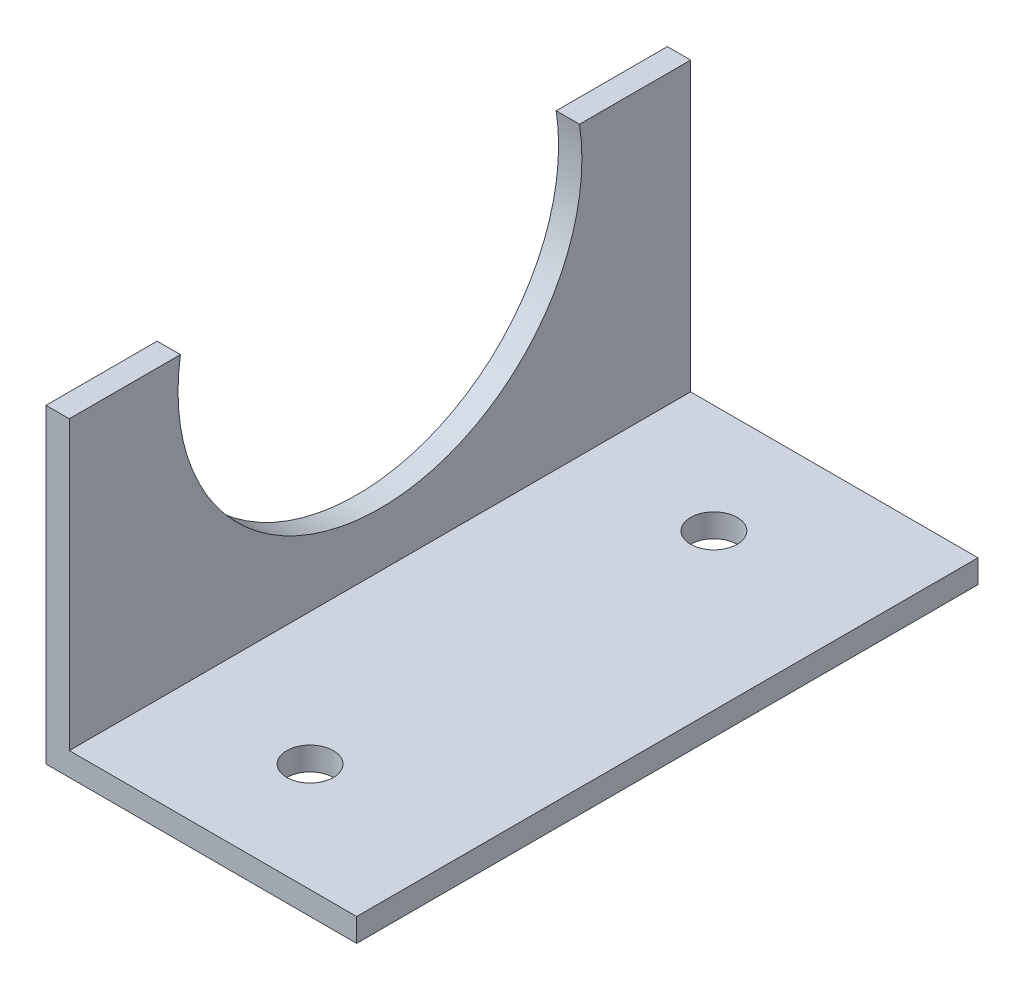
ISO-10303-21;
HEADER;
FILE_DESCRIPTION(('STEP AP214'),'2;1');
FILE_NAME('part.step','',(''),(''),'','','');
FILE_SCHEMA(('AUTOMOTIVE_DESIGN { 1 0 10303 214 1 1 1 1 }'));
ENDSEC;
DATA;
#1=APPLICATION_CONTEXT('core data for automotive mechanical design processes');
#2=APPLICATION_PROTOCOL_DEFINITION('international standard','automotive_design',2000,#1);
#3=PRODUCT_CONTEXT('',#1,'mechanical');
#4=PRODUCT('Part','Part','',(#3));
#5=PRODUCT_RELATED_PRODUCT_CATEGORY('part','',(#4));
#6=PRODUCT_DEFINITION_FORMATION('','',#4);
#7=PRODUCT_DEFINITION_CONTEXT('part definition',#1,'design');
#8=PRODUCT_DEFINITION('design','',#6,#7);
#9=PRODUCT_DEFINITION_SHAPE('','',#8);
#10=(LENGTH_UNIT() NAMED_UNIT(*) SI_UNIT(.MILLI.,.METRE.));
#11=(NAMED_UNIT(*) PLANE_ANGLE_UNIT() SI_UNIT($,.RADIAN.));
#12=(NAMED_UNIT(*) SI_UNIT($,.STERADIAN.) SOLID_ANGLE_UNIT());
#13=UNCERTAINTY_MEASURE_WITH_UNIT(LENGTH_MEASURE(1.E-05),#10,'distance_accuracy_value','');
#14=(GEOMETRIC_REPRESENTATION_CONTEXT(3) GLOBAL_UNCERTAINTY_ASSIGNED_CONTEXT((#13)) GLOBAL_UNIT_ASSIGNED_CONTEXT((#10,
#11,#12)) REPRESENTATION_CONTEXT('',''));
#15=CARTESIAN_POINT('',(0.,0.,0.));
#16=DIRECTION('',(0.,0.,1.));
#17=DIRECTION('',(1.,0.,0.));
#18=AXIS2_PLACEMENT_3D('',#15,#16,#17);
#19=CARTESIAN_POINT('',(0.,20.,40.));
#20=DIRECTION('',(0.,-1.,0.));
#21=DIRECTION('',(0.,0.,-1.));
#22=AXIS2_PLACEMENT_3D('',#19,#20,#21);
#23=PLANE('',#22);
#24=DIRECTION('',(0.,0.,-1.));
#25=VECTOR('',#24,1.);
#26=CARTESIAN_POINT('',(0.,20.,40.));
#27=LINE('',#26,#25);
#28=CARTESIAN_POINT('',(0.,20.,7.15476742133487));
#29=VERTEX_POINT('',#28);
#30=CARTESIAN_POINT('',(0.,20.,0.));
#31=VERTEX_POINT('',#30);
#32=EDGE_CURVE('E146',#29,#31,#27,.T.);
#33=ORIENTED_EDGE('',*,*,#32,.F.);
#34=DIRECTION('',(1.,0.,0.));
#35=VECTOR('',#34,1.);
#36=CARTESIAN_POINT('',(-28.5,20.,7.15476742133487));
#37=LINE('',#36,#35);
#38=CARTESIAN_POINT('',(1.5,20.,7.15476742133487));
#39=VERTEX_POINT('',#38);
#40=EDGE_CURVE('E46',#29,#39,#37,.T.);
#41=ORIENTED_EDGE('',*,*,#40,.T.);
#42=DIRECTION('',(0.,0.,-1.));
#43=VECTOR('',#42,1.);
#44=CARTESIAN_POINT('',(1.5,20.,40.));
#45=LINE('',#44,#43);
#46=CARTESIAN_POINT('',(1.5,20.,0.));
#47=VERTEX_POINT('',#46);
#48=EDGE_CURVE('E120',#39,#47,#45,.T.);
#49=ORIENTED_EDGE('',*,*,#48,.T.);
#50=DIRECTION('',(-1.,0.,0.));
#51=VECTOR('',#50,1.);
#52=CARTESIAN_POINT('',(0.,20.,0.));
#53=LINE('',#52,#51);
#54=EDGE_CURVE('E140',#47,#31,#53,.T.);
#55=ORIENTED_EDGE('',*,*,#54,.T.);
#56=EDGE_LOOP('',(#33,#41,#49,#55));
#57=FACE_BOUND('',#56,.T.);
#58=ADVANCED_FACE('F31',(#57),#23,.F.);
#59=CARTESIAN_POINT('',(20.,0.,40.));
#60=DIRECTION('',(0.,1.,0.));
#61=DIRECTION('',(-1.,0.,0.));
#62=AXIS2_PLACEMENT_3D('',#59,#60,#61);
#63=PLANE('',#62);
#64=CARTESIAN_POINT('',(10.,0.,7.));
#65=DIRECTION('',(0.,1.,0.));
#66=DIRECTION('',(-1.,0.,0.));
#67=AXIS2_PLACEMENT_3D('',#64,#65,#66);
#68=CIRCLE('',#67,1.5);
#69=CARTESIAN_POINT('',(8.5,0.,7.));
#70=VERTEX_POINT('',#69);
#71=EDGE_CURVE('E177',#70,#70,#68,.T.);
#72=ORIENTED_EDGE('',*,*,#71,.T.);
#73=EDGE_LOOP('',(#72));
#74=FACE_BOUND('',#73,.T.);
#75=CARTESIAN_POINT('',(10.,0.,33.));
#76=DIRECTION('',(0.,1.,0.));
#77=DIRECTION('',(-1.,0.,0.));
#78=AXIS2_PLACEMENT_3D('',#75,#76,#77);
#79=CIRCLE('',#78,1.5);
#80=CARTESIAN_POINT('',(8.5,0.,33.));
#81=VERTEX_POINT('',#80);
#82=EDGE_CURVE('E173',#81,#81,#79,.T.);
#83=ORIENTED_EDGE('',*,*,#82,.T.);
#84=EDGE_LOOP('',(#83));
#85=FACE_BOUND('',#84,.T.);
#86=DIRECTION('',(1.,0.,0.));
#87=VECTOR('',#86,1.);
#88=CARTESIAN_POINT('',(20.,0.,0.));
#89=LINE('',#88,#87);
#90=CARTESIAN_POINT('',(0.,0.,0.));
#91=VERTEX_POINT('',#90);
#92=CARTESIAN_POINT('',(20.,0.,0.));
#93=VERTEX_POINT('',#92);
#94=EDGE_CURVE('E130',#91,#93,#89,.T.);
#95=ORIENTED_EDGE('',*,*,#94,.T.);
#96=DIRECTION('',(0.,0.,-1.));
#97=VECTOR('',#96,1.);
#98=CARTESIAN_POINT('',(20.,0.,40.));
#99=LINE('',#98,#97);
#100=CARTESIAN_POINT('',(20.,0.,40.));
#101=VERTEX_POINT('',#100);
#102=EDGE_CURVE('E39',#101,#93,#99,.T.);
#103=ORIENTED_EDGE('',*,*,#102,.F.);
#104=DIRECTION('',(1.,0.,0.));
#105=VECTOR('',#104,1.);
#106=CARTESIAN_POINT('',(20.,0.,40.));
#107=LINE('',#106,#105);
#108=CARTESIAN_POINT('',(0.,0.,40.));
#109=VERTEX_POINT('',#108);
#110=EDGE_CURVE('E144',#109,#101,#107,.T.);
#111=ORIENTED_EDGE('',*,*,#110,.F.);
#112=DIRECTION('',(0.,0.,-1.));
#113=VECTOR('',#112,1.);
#114=CARTESIAN_POINT('',(0.,0.,40.));
#115=LINE('',#114,#113);
#116=EDGE_CURVE('E126',#109,#91,#115,.T.);
#117=ORIENTED_EDGE('',*,*,#116,.T.);
#118=EDGE_LOOP('',(#95,#103,#111,#117));
#119=FACE_BOUND('',#118,.T.);
#120=ADVANCED_FACE('F33',(#74,#85,#119),#63,.F.);
#121=CARTESIAN_POINT('',(20.,1.5,40.));
#122=DIRECTION('',(-1.,0.,0.));
#123=DIRECTION('',(0.,0.,1.));
#124=AXIS2_PLACEMENT_3D('',#121,#122,#123);
#125=PLANE('',#124);
#126=DIRECTION('',(0.,1.,0.));
#127=VECTOR('',#126,1.);
#128=CARTESIAN_POINT('',(20.,1.5,0.));
#129=LINE('',#128,#127);
#130=CARTESIAN_POINT('',(20.,1.5,0.));
#131=VERTEX_POINT('',#130);
#132=EDGE_CURVE('E133',#93,#131,#129,.T.);
#133=ORIENTED_EDGE('',*,*,#132,.T.);
#134=DIRECTION('',(0.,0.,-1.));
#135=VECTOR('',#134,1.);
#136=CARTESIAN_POINT('',(20.,1.5,40.));
#137=LINE('',#136,#135);
#138=CARTESIAN_POINT('',(20.,1.5,40.));
#139=VERTEX_POINT('',#138);
#140=EDGE_CURVE('E149',#139,#131,#137,.T.);
#141=ORIENTED_EDGE('',*,*,#140,.F.);
#142=DIRECTION('',(0.,1.,0.));
#143=VECTOR('',#142,1.);
#144=CARTESIAN_POINT('',(20.,1.5,40.));
#145=LINE('',#144,#143);
#146=EDGE_CURVE('E89',#101,#139,#145,.T.);
#147=ORIENTED_EDGE('',*,*,#146,.F.);
#148=ORIENTED_EDGE('',*,*,#102,.T.);
#149=EDGE_LOOP('',(#133,#141,#147,#148));
#150=FACE_BOUND('',#149,.T.);
#151=ADVANCED_FACE('F152',(#150),#125,.F.);
#152=CARTESIAN_POINT('',(1.5,1.5,40.));
#153=DIRECTION('',(0.,-1.,0.));
#154=DIRECTION('',(0.,0.,-1.));
#155=AXIS2_PLACEMENT_3D('',#152,#153,#154);
#156=PLANE('',#155);
#157=CARTESIAN_POINT('',(10.,1.5,7.));
#158=DIRECTION('',(0.,1.,0.));
#159=DIRECTION('',(-1.,0.,0.));
#160=AXIS2_PLACEMENT_3D('',#157,#158,#159);
#161=CIRCLE('',#160,1.5);
#162=CARTESIAN_POINT('',(8.5,1.5,7.));
#163=VERTEX_POINT('',#162);
#164=EDGE_CURVE('E180',#163,#163,#161,.T.);
#165=ORIENTED_EDGE('',*,*,#164,.F.);
#166=EDGE_LOOP('',(#165));
#167=FACE_BOUND('',#166,.T.);
#168=CARTESIAN_POINT('',(10.,1.5,33.));
#169=DIRECTION('',(0.,1.,0.));
#170=DIRECTION('',(-1.,0.,0.));
#171=AXIS2_PLACEMENT_3D('',#168,#169,#170);
#172=CIRCLE('',#171,1.5);
#173=CARTESIAN_POINT('',(8.5,1.5,33.));
#174=VERTEX_POINT('',#173);
#175=EDGE_CURVE('E174',#174,#174,#172,.T.);
#176=ORIENTED_EDGE('',*,*,#175,.F.);
#177=EDGE_LOOP('',(#176));
#178=FACE_BOUND('',#177,.T.);
#179=DIRECTION('',(-1.,0.,0.));
#180=VECTOR('',#179,1.);
#181=CARTESIAN_POINT('',(1.5,1.5,0.));
#182=LINE('',#181,#180);
#183=CARTESIAN_POINT('',(1.5,1.5,0.));
#184=VERTEX_POINT('',#183);
#185=EDGE_CURVE('E135',#131,#184,#182,.T.);
#186=ORIENTED_EDGE('',*,*,#185,.T.);
#187=DIRECTION('',(0.,0.,-1.));
#188=VECTOR('',#187,1.);
#189=CARTESIAN_POINT('',(1.5,1.5,40.));
#190=LINE('',#189,#188);
#191=CARTESIAN_POINT('',(1.5,1.5,40.));
#192=VERTEX_POINT('',#191);
#193=EDGE_CURVE('E119',#192,#184,#190,.T.);
#194=ORIENTED_EDGE('',*,*,#193,.F.);
#195=DIRECTION('',(-1.,0.,0.));
#196=VECTOR('',#195,1.);
#197=CARTESIAN_POINT('',(1.5,1.5,40.));
#198=LINE('',#197,#196);
#199=EDGE_CURVE('E105',#139,#192,#198,.T.);
#200=ORIENTED_EDGE('',*,*,#199,.F.);
#201=ORIENTED_EDGE('',*,*,#140,.T.);
#202=EDGE_LOOP('',(#186,#194,#200,#201));
#203=FACE_BOUND('',#202,.T.);
#204=ADVANCED_FACE('F162',(#167,#178,#203),#156,.F.);
#205=CARTESIAN_POINT('',(1.5,20.,40.));
#206=DIRECTION('',(-1.,0.,0.));
#207=DIRECTION('',(0.,-1.,0.));
#208=AXIS2_PLACEMENT_3D('',#205,#206,#207);
#209=PLANE('',#208);
#210=ORIENTED_EDGE('',*,*,#48,.F.);
#211=CARTESIAN_POINT('',(1.5,18.,20.));
#212=DIRECTION('',(1.,0.,0.));
#213=DIRECTION('',(0.,1.,0.));
#214=AXIS2_PLACEMENT_3D('',#211,#212,#213);
#215=CIRCLE('',#214,13.);
#216=CARTESIAN_POINT('',(1.5,20.,32.8452325786651));
#217=VERTEX_POINT('',#216);
#218=EDGE_CURVE('E116',#217,#39,#215,.T.);
#219=ORIENTED_EDGE('',*,*,#218,.F.);
#220=CARTESIAN_POINT('',(1.5,20.,40.));
#221=VERTEX_POINT('',#220);
#222=EDGE_CURVE('E112',#221,#217,#45,.T.);
#223=ORIENTED_EDGE('',*,*,#222,.F.);
#224=DIRECTION('',(0.,1.,0.));
#225=VECTOR('',#224,1.);
#226=CARTESIAN_POINT('',(1.5,20.,40.));
#227=LINE('',#226,#225);
#228=EDGE_CURVE('E98',#192,#221,#227,.T.);
#229=ORIENTED_EDGE('',*,*,#228,.F.);
#230=ORIENTED_EDGE('',*,*,#193,.T.);
#231=DIRECTION('',(0.,1.,0.));
#232=VECTOR('',#231,1.);
#233=CARTESIAN_POINT('',(1.5,20.,0.));
#234=LINE('',#233,#232);
#235=EDGE_CURVE('E137',#184,#47,#234,.T.);
#236=ORIENTED_EDGE('',*,*,#235,.T.);
#237=EDGE_LOOP('',(#210,#219,#223,#229,#230,#236));
#238=FACE_BOUND('',#237,.T.);
#239=ADVANCED_FACE('F114',(#238),#209,.F.);
#240=ORIENTED_EDGE('',*,*,#222,.T.);
#241=DIRECTION('',(1.,0.,0.));
#242=VECTOR('',#241,1.);
#243=CARTESIAN_POINT('',(-28.5,20.,32.8452325786651));
#244=LINE('',#243,#242);
#245=CARTESIAN_POINT('',(0.,20.,32.8452325786651));
#246=VERTEX_POINT('',#245);
#247=EDGE_CURVE('E166',#217,#246,#244,.F.);
#248=ORIENTED_EDGE('',*,*,#247,.T.);
#249=CARTESIAN_POINT('',(0.,20.,40.));
#250=VERTEX_POINT('',#249);
#251=EDGE_CURVE('E124',#250,#246,#27,.T.);
#252=ORIENTED_EDGE('',*,*,#251,.F.);
#253=DIRECTION('',(-1.,0.,0.));
#254=VECTOR('',#253,1.);
#255=CARTESIAN_POINT('',(0.,20.,40.));
#256=LINE('',#255,#254);
#257=EDGE_CURVE('E102',#221,#250,#256,.T.);
#258=ORIENTED_EDGE('',*,*,#257,.F.);
#259=EDGE_LOOP('',(#240,#248,#252,#258));
#260=FACE_BOUND('',#259,.T.);
#261=ADVANCED_FACE('F122',(#260),#23,.F.);
#262=CARTESIAN_POINT('',(0.,0.,40.));
#263=DIRECTION('',(1.,0.,0.));
#264=DIRECTION('',(0.,0.,-1.));
#265=AXIS2_PLACEMENT_3D('',#262,#263,#264);
#266=PLANE('',#265);
#267=ORIENTED_EDGE('',*,*,#251,.T.);
#268=CARTESIAN_POINT('',(0.,18.,20.));
#269=DIRECTION('',(1.,0.,0.));
#270=DIRECTION('',(0.,0.,-1.));
#271=AXIS2_PLACEMENT_3D('',#268,#269,#270);
#272=CIRCLE('',#271,13.);
#273=EDGE_CURVE('E11',#246,#29,#272,.T.);
#274=ORIENTED_EDGE('',*,*,#273,.T.);
#275=ORIENTED_EDGE('',*,*,#32,.T.);
#276=DIRECTION('',(0.,-1.,0.));
#277=VECTOR('',#276,1.);
#278=CARTESIAN_POINT('',(0.,0.,0.));
#279=LINE('',#278,#277);
#280=EDGE_CURVE('E80',#31,#91,#279,.T.);
#281=ORIENTED_EDGE('',*,*,#280,.T.);
#282=ORIENTED_EDGE('',*,*,#116,.F.);
#283=DIRECTION('',(0.,-1.,0.));
#284=VECTOR('',#283,1.);
#285=CARTESIAN_POINT('',(0.,0.,40.));
#286=LINE('',#285,#284);
#287=EDGE_CURVE('E54',#250,#109,#286,.T.);
#288=ORIENTED_EDGE('',*,*,#287,.F.);
#289=EDGE_LOOP('',(#267,#274,#275,#281,#282,#288));
#290=FACE_BOUND('',#289,.T.);
#291=ADVANCED_FACE('F217',(#290),#266,.F.);
#292=CARTESIAN_POINT('',(0.,0.,40.));
#293=DIRECTION('',(0.,0.,-1.));
#294=DIRECTION('',(-1.,0.,0.));
#295=AXIS2_PLACEMENT_3D('',#292,#293,#294);
#296=PLANE('',#295);
#297=ORIENTED_EDGE('',*,*,#110,.T.);
#298=ORIENTED_EDGE('',*,*,#146,.T.);
#299=ORIENTED_EDGE('',*,*,#199,.T.);
#300=ORIENTED_EDGE('',*,*,#228,.T.);
#301=ORIENTED_EDGE('',*,*,#257,.T.);
#302=ORIENTED_EDGE('',*,*,#287,.T.);
#303=EDGE_LOOP('',(#297,#298,#299,#300,#301,#302));
#304=FACE_BOUND('',#303,.T.);
#305=ADVANCED_FACE('F100',(#304),#296,.F.);
#306=CARTESIAN_POINT('',(0.,0.,0.));
#307=DIRECTION('',(0.,0.,-1.));
#308=DIRECTION('',(-1.,0.,0.));
#309=AXIS2_PLACEMENT_3D('',#306,#307,#308);
#310=PLANE('',#309);
#311=ORIENTED_EDGE('',*,*,#94,.F.);
#312=ORIENTED_EDGE('',*,*,#280,.F.);
#313=ORIENTED_EDGE('',*,*,#54,.F.);
#314=ORIENTED_EDGE('',*,*,#235,.F.);
#315=ORIENTED_EDGE('',*,*,#185,.F.);
#316=ORIENTED_EDGE('',*,*,#132,.F.);
#317=EDGE_LOOP('',(#311,#312,#313,#314,#315,#316));
#318=FACE_BOUND('',#317,.T.);
#319=ADVANCED_FACE('F157',(#318),#310,.T.);
#320=CARTESIAN_POINT('',(-28.5,18.,20.));
#321=DIRECTION('',(1.,0.,0.));
#322=DIRECTION('',(0.,1.,0.));
#323=AXIS2_PLACEMENT_3D('',#320,#321,#322);
#324=CYLINDRICAL_SURFACE('',#323,13.);
#325=ORIENTED_EDGE('',*,*,#273,.F.);
#326=ORIENTED_EDGE('',*,*,#247,.F.);
#327=ORIENTED_EDGE('',*,*,#218,.T.);
#328=ORIENTED_EDGE('',*,*,#40,.F.);
#329=EDGE_LOOP('',(#325,#326,#327,#328));
#330=FACE_BOUND('',#329,.T.);
#331=ADVANCED_FACE('F201',(#330),#324,.F.);
#332=CARTESIAN_POINT('',(10.,0.,33.));
#333=DIRECTION('',(0.,1.,0.));
#334=DIRECTION('',(-1.,0.,0.));
#335=AXIS2_PLACEMENT_3D('',#332,#333,#334);
#336=CYLINDRICAL_SURFACE('',#335,1.5);
#337=ORIENTED_EDGE('',*,*,#82,.F.);
#338=EDGE_LOOP('',(#337));
#339=FACE_BOUND('',#338,.T.);
#340=ORIENTED_EDGE('',*,*,#175,.T.);
#341=EDGE_LOOP('',(#340));
#342=FACE_BOUND('',#341,.T.);
#343=ADVANCED_FACE('F191',(#339,#342),#336,.F.);
#344=CARTESIAN_POINT('',(10.,0.,7.));
#345=DIRECTION('',(0.,1.,0.));
#346=DIRECTION('',(-1.,0.,0.));
#347=AXIS2_PLACEMENT_3D('',#344,#345,#346);
#348=CYLINDRICAL_SURFACE('',#347,1.5);
#349=ORIENTED_EDGE('',*,*,#71,.F.);
#350=EDGE_LOOP('',(#349));
#351=FACE_BOUND('',#350,.T.);
#352=ORIENTED_EDGE('',*,*,#164,.T.);
#353=EDGE_LOOP('',(#352));
#354=FACE_BOUND('',#353,.T.);
#355=ADVANCED_FACE('F188',(#351,#354),#348,.F.);
#356=CLOSED_SHELL('',(#58,#120,#151,#204,#239,#261,#291,#305,#319,#331,#343,#355));
#357=MANIFOLD_SOLID_BREP('B2',#356);
#358=ADVANCED_BREP_SHAPE_REPRESENTATION('',(#18,#357),#14);
#359=SHAPE_DEFINITION_REPRESENTATION(#9,#358);
ENDSEC;
END-ISO-10303-21;
